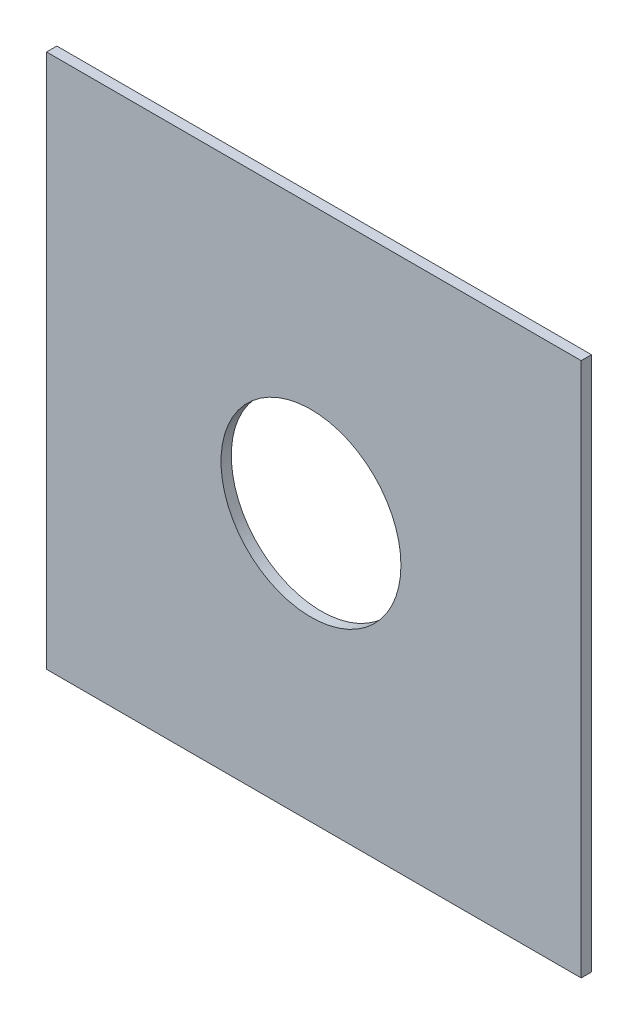
ISO-10303-21;
HEADER;
FILE_DESCRIPTION(('STEP AP214'),'2;1');
FILE_NAME('part.step','',(''),(''),'','','');
FILE_SCHEMA(('AUTOMOTIVE_DESIGN { 1 0 10303 214 1 1 1 1 }'));
ENDSEC;
DATA;
#1=APPLICATION_CONTEXT('core data for automotive mechanical design processes');
#2=APPLICATION_PROTOCOL_DEFINITION('international standard','automotive_design',2000,#1);
#3=PRODUCT_CONTEXT('',#1,'mechanical');
#4=PRODUCT('Part','Part','',(#3));
#5=PRODUCT_RELATED_PRODUCT_CATEGORY('part','',(#4));
#6=PRODUCT_DEFINITION_FORMATION('','',#4);
#7=PRODUCT_DEFINITION_CONTEXT('part definition',#1,'design');
#8=PRODUCT_DEFINITION('design','',#6,#7);
#9=PRODUCT_DEFINITION_SHAPE('','',#8);
#10=(LENGTH_UNIT() NAMED_UNIT(*) SI_UNIT(.MILLI.,.METRE.));
#11=(NAMED_UNIT(*) PLANE_ANGLE_UNIT() SI_UNIT($,.RADIAN.));
#12=(NAMED_UNIT(*) SI_UNIT($,.STERADIAN.) SOLID_ANGLE_UNIT());
#13=UNCERTAINTY_MEASURE_WITH_UNIT(LENGTH_MEASURE(1.E-05),#10,'distance_accuracy_value','');
#14=(GEOMETRIC_REPRESENTATION_CONTEXT(3) GLOBAL_UNCERTAINTY_ASSIGNED_CONTEXT((#13)) GLOBAL_UNIT_ASSIGNED_CONTEXT((#10,
#11,#12)) REPRESENTATION_CONTEXT('',''));
#15=CARTESIAN_POINT('',(0.,0.,0.));
#16=DIRECTION('',(0.,0.,1.));
#17=DIRECTION('',(1.,0.,0.));
#18=AXIS2_PLACEMENT_3D('',#15,#16,#17);
#19=CARTESIAN_POINT('',(0.,0.,10.));
#20=DIRECTION('',(0.,0.,1.));
#21=DIRECTION('',(1.,0.,0.));
#22=AXIS2_PLACEMENT_3D('',#19,#20,#21);
#23=PLANE('',#22);
#24=DIRECTION('',(0.,-1.,0.));
#25=VECTOR('',#24,1.);
#26=CARTESIAN_POINT('',(-257.185871696522,260.,10.));
#27=LINE('',#26,#25);
#28=CARTESIAN_POINT('',(-257.185871696522,260.,10.));
#29=VERTEX_POINT('',#28);
#30=CARTESIAN_POINT('',(-257.185871696522,-260.,10.));
#31=VERTEX_POINT('',#30);
#32=EDGE_CURVE('E93',#29,#31,#27,.T.);
#33=ORIENTED_EDGE('',*,*,#32,.T.);
#34=DIRECTION('',(1.,0.,0.));
#35=VECTOR('',#34,1.);
#36=CARTESIAN_POINT('',(-257.185871696522,-260.,10.));
#37=LINE('',#36,#35);
#38=CARTESIAN_POINT('',(262.814128303478,-260.,10.));
#39=VERTEX_POINT('',#38);
#40=EDGE_CURVE('E88',#31,#39,#37,.T.);
#41=ORIENTED_EDGE('',*,*,#40,.T.);
#42=DIRECTION('',(0.,1.,0.));
#43=VECTOR('',#42,1.);
#44=CARTESIAN_POINT('',(262.814128303478,260.,10.));
#45=LINE('',#44,#43);
#46=CARTESIAN_POINT('',(262.814128303478,260.,10.));
#47=VERTEX_POINT('',#46);
#48=EDGE_CURVE('E91',#39,#47,#45,.T.);
#49=ORIENTED_EDGE('',*,*,#48,.T.);
#50=DIRECTION('',(-1.,0.,0.));
#51=VECTOR('',#50,1.);
#52=CARTESIAN_POINT('',(-257.185871696522,260.,10.));
#53=LINE('',#52,#51);
#54=EDGE_CURVE('E58',#47,#29,#53,.T.);
#55=ORIENTED_EDGE('',*,*,#54,.T.);
#56=EDGE_LOOP('',(#33,#41,#49,#55));
#57=FACE_BOUND('',#56,.T.);
#58=CARTESIAN_POINT('',(0.,0.,10.));
#59=DIRECTION('',(0.,0.,1.));
#60=DIRECTION('',(1.,0.,0.));
#61=AXIS2_PLACEMENT_3D('',#58,#59,#60);
#62=CIRCLE('',#61,87.5);
#63=CARTESIAN_POINT('',(87.5,0.,10.));
#64=VERTEX_POINT('',#63);
#65=EDGE_CURVE('E108',#64,#64,#62,.T.);
#66=ORIENTED_EDGE('',*,*,#65,.F.);
#67=EDGE_LOOP('',(#66));
#68=FACE_BOUND('',#67,.T.);
#69=ADVANCED_FACE('F41',(#57,#68),#23,.T.);
#70=CARTESIAN_POINT('',(0.,0.,0.));
#71=DIRECTION('',(0.,0.,1.));
#72=DIRECTION('',(1.,0.,0.));
#73=AXIS2_PLACEMENT_3D('',#70,#71,#72);
#74=PLANE('',#73);
#75=DIRECTION('',(0.,-1.,0.));
#76=VECTOR('',#75,1.);
#77=CARTESIAN_POINT('',(-257.185871696522,260.,0.));
#78=LINE('',#77,#76);
#79=CARTESIAN_POINT('',(-257.185871696522,260.,0.));
#80=VERTEX_POINT('',#79);
#81=CARTESIAN_POINT('',(-257.185871696522,-260.,0.));
#82=VERTEX_POINT('',#81);
#83=EDGE_CURVE('E105',#80,#82,#78,.T.);
#84=ORIENTED_EDGE('',*,*,#83,.F.);
#85=DIRECTION('',(-1.,0.,0.));
#86=VECTOR('',#85,1.);
#87=CARTESIAN_POINT('',(-257.185871696522,260.,0.));
#88=LINE('',#87,#86);
#89=CARTESIAN_POINT('',(262.814128303478,260.,0.));
#90=VERTEX_POINT('',#89);
#91=EDGE_CURVE('E81',#90,#80,#88,.T.);
#92=ORIENTED_EDGE('',*,*,#91,.F.);
#93=DIRECTION('',(0.,1.,0.));
#94=VECTOR('',#93,1.);
#95=CARTESIAN_POINT('',(262.814128303478,260.,0.));
#96=LINE('',#95,#94);
#97=CARTESIAN_POINT('',(262.814128303478,-260.,0.));
#98=VERTEX_POINT('',#97);
#99=EDGE_CURVE('E75',#98,#90,#96,.T.);
#100=ORIENTED_EDGE('',*,*,#99,.F.);
#101=DIRECTION('',(1.,0.,0.));
#102=VECTOR('',#101,1.);
#103=CARTESIAN_POINT('',(-257.185871696522,-260.,0.));
#104=LINE('',#103,#102);
#105=EDGE_CURVE('E97',#82,#98,#104,.T.);
#106=ORIENTED_EDGE('',*,*,#105,.F.);
#107=EDGE_LOOP('',(#84,#92,#100,#106));
#108=FACE_BOUND('',#107,.T.);
#109=CARTESIAN_POINT('',(0.,0.,0.));
#110=DIRECTION('',(0.,0.,1.));
#111=DIRECTION('',(1.,0.,0.));
#112=AXIS2_PLACEMENT_3D('',#109,#110,#111);
#113=CIRCLE('',#112,87.5);
#114=CARTESIAN_POINT('',(87.5,0.,0.));
#115=VERTEX_POINT('',#114);
#116=EDGE_CURVE('E120',#115,#115,#113,.T.);
#117=ORIENTED_EDGE('',*,*,#116,.T.);
#118=EDGE_LOOP('',(#117));
#119=FACE_BOUND('',#118,.T.);
#120=ADVANCED_FACE('F116',(#108,#119),#74,.F.);
#121=CARTESIAN_POINT('',(-257.185871696522,260.,10.));
#122=DIRECTION('',(1.,0.,0.));
#123=DIRECTION('',(0.,1.,0.));
#124=AXIS2_PLACEMENT_3D('',#121,#122,#123);
#125=PLANE('',#124);
#126=ORIENTED_EDGE('',*,*,#83,.T.);
#127=DIRECTION('',(0.,0.,-1.));
#128=VECTOR('',#127,1.);
#129=CARTESIAN_POINT('',(-257.185871696522,-260.,10.));
#130=LINE('',#129,#128);
#131=EDGE_CURVE('E11',#31,#82,#130,.T.);
#132=ORIENTED_EDGE('',*,*,#131,.F.);
#133=ORIENTED_EDGE('',*,*,#32,.F.);
#134=DIRECTION('',(0.,0.,-1.));
#135=VECTOR('',#134,1.);
#136=CARTESIAN_POINT('',(-257.185871696522,260.,10.));
#137=LINE('',#136,#135);
#138=EDGE_CURVE('E101',#29,#80,#137,.T.);
#139=ORIENTED_EDGE('',*,*,#138,.T.);
#140=EDGE_LOOP('',(#126,#132,#133,#139));
#141=FACE_BOUND('',#140,.T.);
#142=ADVANCED_FACE('F43',(#141),#125,.F.);
#143=CARTESIAN_POINT('',(-257.185871696522,-260.,10.));
#144=DIRECTION('',(0.,1.,0.));
#145=DIRECTION('',(0.,0.,1.));
#146=AXIS2_PLACEMENT_3D('',#143,#144,#145);
#147=PLANE('',#146);
#148=ORIENTED_EDGE('',*,*,#105,.T.);
#149=DIRECTION('',(0.,0.,-1.));
#150=VECTOR('',#149,1.);
#151=CARTESIAN_POINT('',(262.814128303478,-260.,10.));
#152=LINE('',#151,#150);
#153=EDGE_CURVE('E50',#39,#98,#152,.T.);
#154=ORIENTED_EDGE('',*,*,#153,.F.);
#155=ORIENTED_EDGE('',*,*,#40,.F.);
#156=ORIENTED_EDGE('',*,*,#131,.T.);
#157=EDGE_LOOP('',(#148,#154,#155,#156));
#158=FACE_BOUND('',#157,.T.);
#159=ADVANCED_FACE('F96',(#158),#147,.F.);
#160=CARTESIAN_POINT('',(262.814128303478,260.,10.));
#161=DIRECTION('',(-1.,0.,0.));
#162=DIRECTION('',(0.,-1.,0.));
#163=AXIS2_PLACEMENT_3D('',#160,#161,#162);
#164=PLANE('',#163);
#165=ORIENTED_EDGE('',*,*,#99,.T.);
#166=DIRECTION('',(0.,0.,-1.));
#167=VECTOR('',#166,1.);
#168=CARTESIAN_POINT('',(262.814128303478,260.,10.));
#169=LINE('',#168,#167);
#170=EDGE_CURVE('E98',#47,#90,#169,.T.);
#171=ORIENTED_EDGE('',*,*,#170,.F.);
#172=ORIENTED_EDGE('',*,*,#48,.F.);
#173=ORIENTED_EDGE('',*,*,#153,.T.);
#174=EDGE_LOOP('',(#165,#171,#172,#173));
#175=FACE_BOUND('',#174,.T.);
#176=ADVANCED_FACE('F99',(#175),#164,.F.);
#177=CARTESIAN_POINT('',(-257.185871696522,260.,10.));
#178=DIRECTION('',(0.,-1.,0.));
#179=DIRECTION('',(0.,0.,-1.));
#180=AXIS2_PLACEMENT_3D('',#177,#178,#179);
#181=PLANE('',#180);
#182=ORIENTED_EDGE('',*,*,#91,.T.);
#183=ORIENTED_EDGE('',*,*,#138,.F.);
#184=ORIENTED_EDGE('',*,*,#54,.F.);
#185=ORIENTED_EDGE('',*,*,#170,.T.);
#186=EDGE_LOOP('',(#182,#183,#184,#185));
#187=FACE_BOUND('',#186,.T.);
#188=ADVANCED_FACE('F113',(#187),#181,.F.);
#189=CARTESIAN_POINT('',(0.,0.,10.));
#190=DIRECTION('',(0.,0.,-1.));
#191=DIRECTION('',(-1.,0.,0.));
#192=AXIS2_PLACEMENT_3D('',#189,#190,#191);
#193=CYLINDRICAL_SURFACE('',#192,87.5);
#194=ORIENTED_EDGE('',*,*,#65,.T.);
#195=EDGE_LOOP('',(#194));
#196=FACE_BOUND('',#195,.T.);
#197=ORIENTED_EDGE('',*,*,#116,.F.);
#198=EDGE_LOOP('',(#197));
#199=FACE_BOUND('',#198,.T.);
#200=ADVANCED_FACE('F126',(#196,#199),#193,.F.);
#201=CLOSED_SHELL('',(#69,#120,#142,#159,#176,#188,#200));
#202=MANIFOLD_SOLID_BREP('B2',#201);
#203=ADVANCED_BREP_SHAPE_REPRESENTATION('',(#18,#202),#14);
#204=SHAPE_DEFINITION_REPRESENTATION(#9,#203);
ENDSEC;
END-ISO-10303-21;
